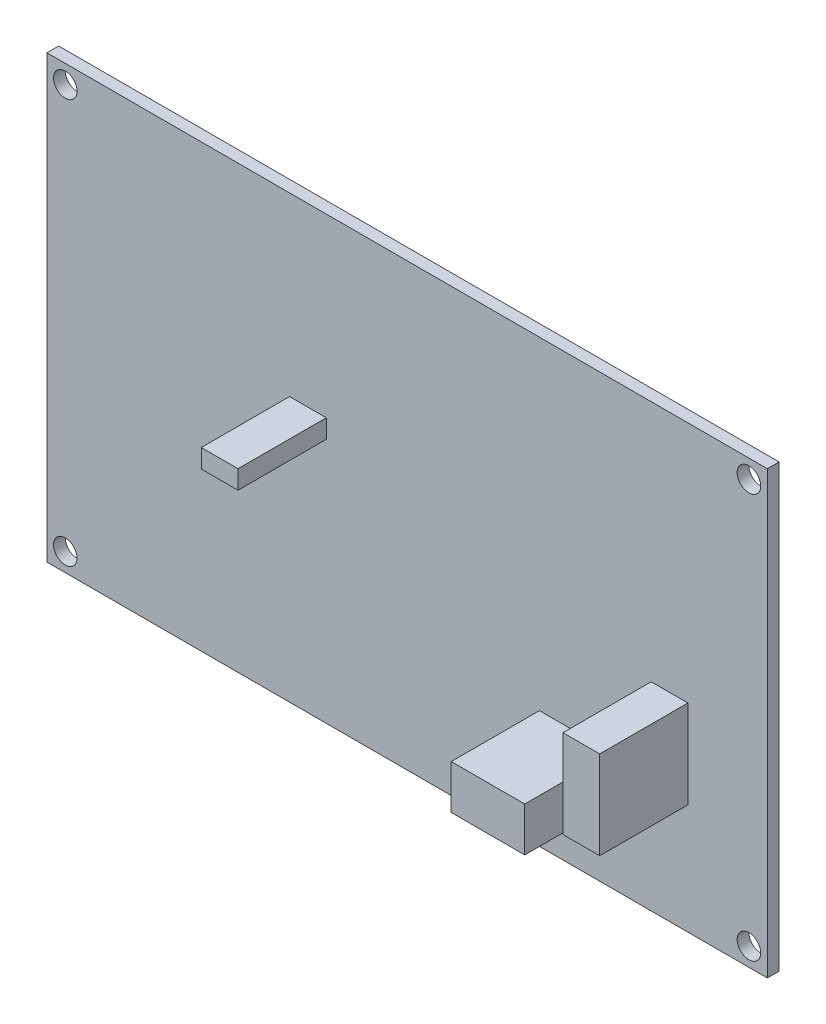
ISO-10303-21;
HEADER;
FILE_DESCRIPTION(('STEP AP214'),'2;1');
FILE_NAME('part.step','',(''),(''),'','','');
FILE_SCHEMA(('AUTOMOTIVE_DESIGN { 1 0 10303 214 1 1 1 1 }'));
ENDSEC;
DATA;
#1=APPLICATION_CONTEXT('core data for automotive mechanical design processes');
#2=APPLICATION_PROTOCOL_DEFINITION('international standard','automotive_design',2000,#1);
#3=PRODUCT_CONTEXT('',#1,'mechanical');
#4=PRODUCT('Part','Part','',(#3));
#5=PRODUCT_RELATED_PRODUCT_CATEGORY('part','',(#4));
#6=PRODUCT_DEFINITION_FORMATION('','',#4);
#7=PRODUCT_DEFINITION_CONTEXT('part definition',#1,'design');
#8=PRODUCT_DEFINITION('design','',#6,#7);
#9=PRODUCT_DEFINITION_SHAPE('','',#8);
#10=(LENGTH_UNIT() NAMED_UNIT(*) SI_UNIT(.MILLI.,.METRE.));
#11=(NAMED_UNIT(*) PLANE_ANGLE_UNIT() SI_UNIT($,.RADIAN.));
#12=(NAMED_UNIT(*) SI_UNIT($,.STERADIAN.) SOLID_ANGLE_UNIT());
#13=UNCERTAINTY_MEASURE_WITH_UNIT(LENGTH_MEASURE(1.E-05),#10,'distance_accuracy_value','');
#14=(GEOMETRIC_REPRESENTATION_CONTEXT(3) GLOBAL_UNCERTAINTY_ASSIGNED_CONTEXT((#13)) GLOBAL_UNIT_ASSIGNED_CONTEXT((#10,
#11,#12)) REPRESENTATION_CONTEXT('',''));
#15=CARTESIAN_POINT('',(0.,0.,0.));
#16=DIRECTION('',(0.,0.,1.));
#17=DIRECTION('',(1.,0.,0.));
#18=AXIS2_PLACEMENT_3D('',#15,#16,#17);
#19=CARTESIAN_POINT('',(0.,0.,1.6));
#20=DIRECTION('',(0.,0.,1.));
#21=DIRECTION('',(1.,0.,0.));
#22=AXIS2_PLACEMENT_3D('',#19,#20,#21);
#23=PLANE('',#22);
#24=CARTESIAN_POINT('',(46.5,27.5,1.6));
#25=DIRECTION('',(0.,0.,-1.));
#26=DIRECTION('',(-1.,0.,0.));
#27=AXIS2_PLACEMENT_3D('',#24,#25,#26);
#28=CIRCLE('',#27,1.6);
#29=CARTESIAN_POINT('',(44.9,27.5,1.6));
#30=VERTEX_POINT('',#29);
#31=EDGE_CURVE('E234',#30,#30,#28,.T.);
#32=ORIENTED_EDGE('',*,*,#31,.T.);
#33=EDGE_LOOP('',(#32));
#34=FACE_BOUND('',#33,.T.);
#35=CARTESIAN_POINT('',(46.5,-27.5,1.6));
#36=DIRECTION('',(0.,0.,1.));
#37=DIRECTION('',(-1.,0.,0.));
#38=AXIS2_PLACEMENT_3D('',#35,#36,#37);
#39=CIRCLE('',#38,1.6);
#40=CARTESIAN_POINT('',(44.9,-27.5,1.6));
#41=VERTEX_POINT('',#40);
#42=EDGE_CURVE('E238',#41,#41,#39,.T.);
#43=ORIENTED_EDGE('',*,*,#42,.F.);
#44=EDGE_LOOP('',(#43));
#45=FACE_BOUND('',#44,.T.);
#46=CARTESIAN_POINT('',(-46.5,-27.5,1.6));
#47=DIRECTION('',(0.,0.,-1.));
#48=DIRECTION('',(1.,0.,0.));
#49=AXIS2_PLACEMENT_3D('',#46,#47,#48);
#50=CIRCLE('',#49,1.6);
#51=CARTESIAN_POINT('',(-44.9,-27.5,1.6));
#52=VERTEX_POINT('',#51);
#53=EDGE_CURVE('E244',#52,#52,#50,.T.);
#54=ORIENTED_EDGE('',*,*,#53,.T.);
#55=EDGE_LOOP('',(#54));
#56=FACE_BOUND('',#55,.T.);
#57=CARTESIAN_POINT('',(-46.5,27.5,1.6));
#58=DIRECTION('',(0.,0.,1.));
#59=DIRECTION('',(1.,0.,0.));
#60=AXIS2_PLACEMENT_3D('',#57,#58,#59);
#61=CIRCLE('',#60,1.6);
#62=CARTESIAN_POINT('',(-44.9,27.5,1.6));
#63=VERTEX_POINT('',#62);
#64=EDGE_CURVE('E250',#63,#63,#61,.T.);
#65=ORIENTED_EDGE('',*,*,#64,.F.);
#66=EDGE_LOOP('',(#65));
#67=FACE_BOUND('',#66,.T.);
#68=DIRECTION('',(0.,1.,0.));
#69=VECTOR('',#68,1.);
#70=CARTESIAN_POINT('',(49.,30.,1.6));
#71=LINE('',#70,#69);
#72=CARTESIAN_POINT('',(49.,-30.,1.6));
#73=VERTEX_POINT('',#72);
#74=CARTESIAN_POINT('',(49.,30.,1.6));
#75=VERTEX_POINT('',#74);
#76=EDGE_CURVE('E259',#73,#75,#71,.T.);
#77=ORIENTED_EDGE('',*,*,#76,.T.);
#78=DIRECTION('',(-1.,0.,0.));
#79=VECTOR('',#78,1.);
#80=CARTESIAN_POINT('',(-49.,30.,1.6));
#81=LINE('',#80,#79);
#82=CARTESIAN_POINT('',(-49.,30.,1.6));
#83=VERTEX_POINT('',#82);
#84=EDGE_CURVE('E262',#75,#83,#81,.T.);
#85=ORIENTED_EDGE('',*,*,#84,.T.);
#86=DIRECTION('',(0.,-1.,0.));
#87=VECTOR('',#86,1.);
#88=CARTESIAN_POINT('',(-49.,30.,1.6));
#89=LINE('',#88,#87);
#90=CARTESIAN_POINT('',(-49.,-30.,1.6));
#91=VERTEX_POINT('',#90);
#92=EDGE_CURVE('E265',#83,#91,#89,.T.);
#93=ORIENTED_EDGE('',*,*,#92,.T.);
#94=DIRECTION('',(1.,0.,0.));
#95=VECTOR('',#94,1.);
#96=CARTESIAN_POINT('',(-49.,-30.,1.6));
#97=LINE('',#96,#95);
#98=EDGE_CURVE('E267',#91,#73,#97,.T.);
#99=ORIENTED_EDGE('',*,*,#98,.T.);
#100=EDGE_LOOP('',(#77,#85,#93,#99));
#101=FACE_BOUND('',#100,.T.);
#102=DIRECTION('',(1.,0.,0.));
#103=VECTOR('',#102,1.);
#104=CARTESIAN_POINT('',(33.2,-15.,1.6));
#105=LINE('',#104,#103);
#106=CARTESIAN_POINT('',(33.2,-15.,1.6));
#107=VERTEX_POINT('',#106);
#108=CARTESIAN_POINT('',(38.2,-15.,1.6));
#109=VERTEX_POINT('',#108);
#110=EDGE_CURVE('E219',#107,#109,#105,.T.);
#111=ORIENTED_EDGE('',*,*,#110,.F.);
#112=DIRECTION('',(0.,-1.,0.));
#113=VECTOR('',#112,1.);
#114=CARTESIAN_POINT('',(33.2,-3.,1.6));
#115=LINE('',#114,#113);
#116=CARTESIAN_POINT('',(33.2,-3.,1.6));
#117=VERTEX_POINT('',#116);
#118=EDGE_CURVE('E205',#117,#107,#115,.T.);
#119=ORIENTED_EDGE('',*,*,#118,.F.);
#120=DIRECTION('',(-1.,0.,0.));
#121=VECTOR('',#120,1.);
#122=CARTESIAN_POINT('',(33.2,-3.,1.6));
#123=LINE('',#122,#121);
#124=CARTESIAN_POINT('',(38.2,-3.,1.6));
#125=VERTEX_POINT('',#124);
#126=EDGE_CURVE('E210',#125,#117,#123,.T.);
#127=ORIENTED_EDGE('',*,*,#126,.F.);
#128=DIRECTION('',(0.,1.,0.));
#129=VECTOR('',#128,1.);
#130=CARTESIAN_POINT('',(38.2,-3.,1.6));
#131=LINE('',#130,#129);
#132=EDGE_CURVE('E221',#109,#125,#131,.T.);
#133=ORIENTED_EDGE('',*,*,#132,.F.);
#134=EDGE_LOOP('',(#111,#119,#127,#133));
#135=FACE_BOUND('',#134,.T.);
#136=DIRECTION('',(1.,0.,0.));
#137=VECTOR('',#136,1.);
#138=CARTESIAN_POINT('',(18.,-20.,1.6));
#139=LINE('',#138,#137);
#140=CARTESIAN_POINT('',(18.,-20.,1.6));
#141=VERTEX_POINT('',#140);
#142=CARTESIAN_POINT('',(28.,-20.,1.6));
#143=VERTEX_POINT('',#142);
#144=EDGE_CURVE('E177',#141,#143,#139,.T.);
#145=ORIENTED_EDGE('',*,*,#144,.F.);
#146=DIRECTION('',(0.,-1.,0.));
#147=VECTOR('',#146,1.);
#148=CARTESIAN_POINT('',(18.,-14.,1.6));
#149=LINE('',#148,#147);
#150=CARTESIAN_POINT('',(18.,-14.,1.6));
#151=VERTEX_POINT('',#150);
#152=EDGE_CURVE('E174',#151,#141,#149,.T.);
#153=ORIENTED_EDGE('',*,*,#152,.F.);
#154=DIRECTION('',(-1.,0.,0.));
#155=VECTOR('',#154,1.);
#156=CARTESIAN_POINT('',(18.,-14.,1.6));
#157=LINE('',#156,#155);
#158=CARTESIAN_POINT('',(28.,-14.,1.6));
#159=VERTEX_POINT('',#158);
#160=EDGE_CURVE('E186',#159,#151,#157,.T.);
#161=ORIENTED_EDGE('',*,*,#160,.F.);
#162=DIRECTION('',(0.,1.,0.));
#163=VECTOR('',#162,1.);
#164=CARTESIAN_POINT('',(28.,-14.,1.6));
#165=LINE('',#164,#163);
#166=EDGE_CURVE('E194',#143,#159,#165,.T.);
#167=ORIENTED_EDGE('',*,*,#166,.F.);
#168=EDGE_LOOP('',(#145,#153,#161,#167));
#169=FACE_BOUND('',#168,.T.);
#170=DIRECTION('',(1.,0.,0.));
#171=VECTOR('',#170,1.);
#172=CARTESIAN_POINT('',(-16.,3.46,1.6));
#173=LINE('',#172,#171);
#174=CARTESIAN_POINT('',(-16.,3.46,1.6));
#175=VERTEX_POINT('',#174);
#176=CARTESIAN_POINT('',(-11.,3.46,1.6));
#177=VERTEX_POINT('',#176);
#178=EDGE_CURVE('E541',#175,#177,#173,.T.);
#179=ORIENTED_EDGE('',*,*,#178,.F.);
#180=DIRECTION('',(0.,-1.,0.));
#181=VECTOR('',#180,1.);
#182=CARTESIAN_POINT('',(-16.,6.,1.6));
#183=LINE('',#182,#181);
#184=CARTESIAN_POINT('',(-16.,6.,1.6));
#185=VERTEX_POINT('',#184);
#186=EDGE_CURVE('E172',#185,#175,#183,.T.);
#187=ORIENTED_EDGE('',*,*,#186,.F.);
#188=DIRECTION('',(-1.,0.,0.));
#189=VECTOR('',#188,1.);
#190=CARTESIAN_POINT('',(-16.,6.,1.6));
#191=LINE('',#190,#189);
#192=CARTESIAN_POINT('',(-11.,6.,1.6));
#193=VERTEX_POINT('',#192);
#194=EDGE_CURVE('E168',#193,#185,#191,.T.);
#195=ORIENTED_EDGE('',*,*,#194,.F.);
#196=DIRECTION('',(0.,1.,0.));
#197=VECTOR('',#196,1.);
#198=CARTESIAN_POINT('',(-11.,6.,1.6));
#199=LINE('',#198,#197);
#200=EDGE_CURVE('E538',#177,#193,#199,.T.);
#201=ORIENTED_EDGE('',*,*,#200,.F.);
#202=EDGE_LOOP('',(#179,#187,#195,#201));
#203=FACE_BOUND('',#202,.T.);
#204=ADVANCED_FACE('F35',(#34,#45,#56,#67,#101,#135,#169,#203),#23,.T.);
#205=CARTESIAN_POINT('',(49.,30.,1.6));
#206=DIRECTION('',(-1.,0.,0.));
#207=DIRECTION('',(0.,0.,1.));
#208=AXIS2_PLACEMENT_3D('',#205,#206,#207);
#209=PLANE('',#208);
#210=DIRECTION('',(0.,1.,0.));
#211=VECTOR('',#210,1.);
#212=CARTESIAN_POINT('',(49.,30.,0.));
#213=LINE('',#212,#211);
#214=CARTESIAN_POINT('',(49.,-30.,0.));
#215=VERTEX_POINT('',#214);
#216=CARTESIAN_POINT('',(49.,30.,0.));
#217=VERTEX_POINT('',#216);
#218=EDGE_CURVE('E256',#215,#217,#213,.T.);
#219=ORIENTED_EDGE('',*,*,#218,.T.);
#220=DIRECTION('',(0.,0.,-1.));
#221=VECTOR('',#220,1.);
#222=CARTESIAN_POINT('',(49.,30.,1.6));
#223=LINE('',#222,#221);
#224=EDGE_CURVE('E11',#75,#217,#223,.T.);
#225=ORIENTED_EDGE('',*,*,#224,.F.);
#226=ORIENTED_EDGE('',*,*,#76,.F.);
#227=DIRECTION('',(0.,0.,-1.));
#228=VECTOR('',#227,1.);
#229=CARTESIAN_POINT('',(49.,-30.,1.6));
#230=LINE('',#229,#228);
#231=EDGE_CURVE('E269',#73,#215,#230,.T.);
#232=ORIENTED_EDGE('',*,*,#231,.T.);
#233=EDGE_LOOP('',(#219,#225,#226,#232));
#234=FACE_BOUND('',#233,.T.);
#235=ADVANCED_FACE('F37',(#234),#209,.F.);
#236=CARTESIAN_POINT('',(-49.,30.,1.6));
#237=DIRECTION('',(0.,-1.,0.));
#238=DIRECTION('',(0.,0.,-1.));
#239=AXIS2_PLACEMENT_3D('',#236,#237,#238);
#240=PLANE('',#239);
#241=DIRECTION('',(-1.,0.,0.));
#242=VECTOR('',#241,1.);
#243=CARTESIAN_POINT('',(-49.,30.,0.));
#244=LINE('',#243,#242);
#245=CARTESIAN_POINT('',(-49.,30.,0.));
#246=VERTEX_POINT('',#245);
#247=EDGE_CURVE('E272',#217,#246,#244,.T.);
#248=ORIENTED_EDGE('',*,*,#247,.T.);
#249=DIRECTION('',(0.,0.,-1.));
#250=VECTOR('',#249,1.);
#251=CARTESIAN_POINT('',(-49.,30.,1.6));
#252=LINE('',#251,#250);
#253=EDGE_CURVE('E43',#83,#246,#252,.T.);
#254=ORIENTED_EDGE('',*,*,#253,.F.);
#255=ORIENTED_EDGE('',*,*,#84,.F.);
#256=ORIENTED_EDGE('',*,*,#224,.T.);
#257=EDGE_LOOP('',(#248,#254,#255,#256));
#258=FACE_BOUND('',#257,.T.);
#259=ADVANCED_FACE('F302',(#258),#240,.F.);
#260=CARTESIAN_POINT('',(-49.,30.,1.6));
#261=DIRECTION('',(1.,0.,0.));
#262=DIRECTION('',(0.,0.,-1.));
#263=AXIS2_PLACEMENT_3D('',#260,#261,#262);
#264=PLANE('',#263);
#265=DIRECTION('',(0.,-1.,0.));
#266=VECTOR('',#265,1.);
#267=CARTESIAN_POINT('',(-49.,30.,0.));
#268=LINE('',#267,#266);
#269=CARTESIAN_POINT('',(-49.,-30.,0.));
#270=VERTEX_POINT('',#269);
#271=EDGE_CURVE('E274',#246,#270,#268,.T.);
#272=ORIENTED_EDGE('',*,*,#271,.T.);
#273=DIRECTION('',(0.,0.,-1.));
#274=VECTOR('',#273,1.);
#275=CARTESIAN_POINT('',(-49.,-30.,1.6));
#276=LINE('',#275,#274);
#277=EDGE_CURVE('E279',#91,#270,#276,.T.);
#278=ORIENTED_EDGE('',*,*,#277,.F.);
#279=ORIENTED_EDGE('',*,*,#92,.F.);
#280=ORIENTED_EDGE('',*,*,#253,.T.);
#281=EDGE_LOOP('',(#272,#278,#279,#280));
#282=FACE_BOUND('',#281,.T.);
#283=ADVANCED_FACE('F286',(#282),#264,.F.);
#284=CARTESIAN_POINT('',(-49.,-30.,1.6));
#285=DIRECTION('',(0.,1.,0.));
#286=DIRECTION('',(-1.,0.,0.));
#287=AXIS2_PLACEMENT_3D('',#284,#285,#286);
#288=PLANE('',#287);
#289=DIRECTION('',(1.,0.,0.));
#290=VECTOR('',#289,1.);
#291=CARTESIAN_POINT('',(-49.,-30.,0.));
#292=LINE('',#291,#290);
#293=EDGE_CURVE('E263',#270,#215,#292,.T.);
#294=ORIENTED_EDGE('',*,*,#293,.T.);
#295=ORIENTED_EDGE('',*,*,#231,.F.);
#296=ORIENTED_EDGE('',*,*,#98,.F.);
#297=ORIENTED_EDGE('',*,*,#277,.T.);
#298=EDGE_LOOP('',(#294,#295,#296,#297));
#299=FACE_BOUND('',#298,.T.);
#300=ADVANCED_FACE('F295',(#299),#288,.F.);
#301=CARTESIAN_POINT('',(0.,0.,0.));
#302=DIRECTION('',(0.,0.,1.));
#303=DIRECTION('',(1.,0.,0.));
#304=AXIS2_PLACEMENT_3D('',#301,#302,#303);
#305=PLANE('',#304);
#306=CARTESIAN_POINT('',(46.5,27.5,0.));
#307=DIRECTION('',(0.,0.,-1.));
#308=DIRECTION('',(-1.,0.,0.));
#309=AXIS2_PLACEMENT_3D('',#306,#307,#308);
#310=CIRCLE('',#309,1.6);
#311=CARTESIAN_POINT('',(44.9,27.5,0.));
#312=VERTEX_POINT('',#311);
#313=EDGE_CURVE('E235',#312,#312,#310,.T.);
#314=ORIENTED_EDGE('',*,*,#313,.F.);
#315=EDGE_LOOP('',(#314));
#316=FACE_BOUND('',#315,.T.);
#317=CARTESIAN_POINT('',(46.5,-27.5,0.));
#318=DIRECTION('',(0.,0.,1.));
#319=DIRECTION('',(-1.,0.,0.));
#320=AXIS2_PLACEMENT_3D('',#317,#318,#319);
#321=CIRCLE('',#320,1.6);
#322=CARTESIAN_POINT('',(44.9,-27.5,0.));
#323=VERTEX_POINT('',#322);
#324=EDGE_CURVE('E241',#323,#323,#321,.T.);
#325=ORIENTED_EDGE('',*,*,#324,.T.);
#326=EDGE_LOOP('',(#325));
#327=FACE_BOUND('',#326,.T.);
#328=CARTESIAN_POINT('',(-46.5,-27.5,0.));
#329=DIRECTION('',(0.,0.,-1.));
#330=DIRECTION('',(1.,0.,0.));
#331=AXIS2_PLACEMENT_3D('',#328,#329,#330);
#332=CIRCLE('',#331,1.6);
#333=CARTESIAN_POINT('',(-44.9,-27.5,0.));
#334=VERTEX_POINT('',#333);
#335=EDGE_CURVE('E247',#334,#334,#332,.T.);
#336=ORIENTED_EDGE('',*,*,#335,.F.);
#337=EDGE_LOOP('',(#336));
#338=FACE_BOUND('',#337,.T.);
#339=CARTESIAN_POINT('',(-46.5,27.5,0.));
#340=DIRECTION('',(0.,0.,1.));
#341=DIRECTION('',(1.,0.,0.));
#342=AXIS2_PLACEMENT_3D('',#339,#340,#341);
#343=CIRCLE('',#342,1.6);
#344=CARTESIAN_POINT('',(-44.9,27.5,0.));
#345=VERTEX_POINT('',#344);
#346=EDGE_CURVE('E253',#345,#345,#343,.T.);
#347=ORIENTED_EDGE('',*,*,#346,.T.);
#348=EDGE_LOOP('',(#347));
#349=FACE_BOUND('',#348,.T.);
#350=ORIENTED_EDGE('',*,*,#218,.F.);
#351=ORIENTED_EDGE('',*,*,#293,.F.);
#352=ORIENTED_EDGE('',*,*,#271,.F.);
#353=ORIENTED_EDGE('',*,*,#247,.F.);
#354=EDGE_LOOP('',(#350,#351,#352,#353));
#355=FACE_BOUND('',#354,.T.);
#356=ADVANCED_FACE('F292',(#316,#327,#338,#349,#355),#305,.F.);
#357=CARTESIAN_POINT('',(-46.5,27.5,0.));
#358=DIRECTION('',(0.,0.,1.));
#359=DIRECTION('',(1.,0.,0.));
#360=AXIS2_PLACEMENT_3D('',#357,#358,#359);
#361=CYLINDRICAL_SURFACE('',#360,1.6);
#362=ORIENTED_EDGE('',*,*,#346,.F.);
#363=EDGE_LOOP('',(#362));
#364=FACE_BOUND('',#363,.T.);
#365=ORIENTED_EDGE('',*,*,#64,.T.);
#366=EDGE_LOOP('',(#365));
#367=FACE_BOUND('',#366,.T.);
#368=ADVANCED_FACE('F317',(#364,#367),#361,.F.);
#369=CARTESIAN_POINT('',(-46.5,-27.5,0.));
#370=DIRECTION('',(0.,0.,1.));
#371=DIRECTION('',(1.,0.,0.));
#372=AXIS2_PLACEMENT_3D('',#369,#370,#371);
#373=CYLINDRICAL_SURFACE('',#372,1.6);
#374=ORIENTED_EDGE('',*,*,#335,.T.);
#375=EDGE_LOOP('',(#374));
#376=FACE_BOUND('',#375,.T.);
#377=ORIENTED_EDGE('',*,*,#53,.F.);
#378=EDGE_LOOP('',(#377));
#379=FACE_BOUND('',#378,.T.);
#380=ADVANCED_FACE('F339',(#376,#379),#373,.F.);
#381=CARTESIAN_POINT('',(46.5,-27.5,0.));
#382=DIRECTION('',(0.,0.,1.));
#383=DIRECTION('',(1.,0.,0.));
#384=AXIS2_PLACEMENT_3D('',#381,#382,#383);
#385=CYLINDRICAL_SURFACE('',#384,1.6);
#386=ORIENTED_EDGE('',*,*,#324,.F.);
#387=EDGE_LOOP('',(#386));
#388=FACE_BOUND('',#387,.T.);
#389=ORIENTED_EDGE('',*,*,#42,.T.);
#390=EDGE_LOOP('',(#389));
#391=FACE_BOUND('',#390,.T.);
#392=ADVANCED_FACE('F345',(#388,#391),#385,.F.);
#393=CARTESIAN_POINT('',(46.5,27.5,0.));
#394=DIRECTION('',(0.,0.,1.));
#395=DIRECTION('',(1.,0.,0.));
#396=AXIS2_PLACEMENT_3D('',#393,#394,#395);
#397=CYLINDRICAL_SURFACE('',#396,1.6);
#398=ORIENTED_EDGE('',*,*,#313,.T.);
#399=EDGE_LOOP('',(#398));
#400=FACE_BOUND('',#399,.T.);
#401=ORIENTED_EDGE('',*,*,#31,.F.);
#402=EDGE_LOOP('',(#401));
#403=FACE_BOUND('',#402,.T.);
#404=ADVANCED_FACE('F351',(#400,#403),#397,.F.);
#405=CARTESIAN_POINT('',(33.2,-3.,13.6));
#406=DIRECTION('',(1.,0.,0.));
#407=DIRECTION('',(0.,1.,0.));
#408=AXIS2_PLACEMENT_3D('',#405,#406,#407);
#409=PLANE('',#408);
#410=ORIENTED_EDGE('',*,*,#118,.T.);
#411=DIRECTION('',(0.,0.,-1.));
#412=VECTOR('',#411,1.);
#413=CARTESIAN_POINT('',(33.2,-15.,13.6));
#414=LINE('',#413,#412);
#415=CARTESIAN_POINT('',(33.2,-15.,13.6));
#416=VERTEX_POINT('',#415);
#417=EDGE_CURVE('E232',#416,#107,#414,.T.);
#418=ORIENTED_EDGE('',*,*,#417,.F.);
#419=DIRECTION('',(0.,-1.,0.));
#420=VECTOR('',#419,1.);
#421=CARTESIAN_POINT('',(33.2,-3.,13.6));
#422=LINE('',#421,#420);
#423=CARTESIAN_POINT('',(33.2,-3.,13.6));
#424=VERTEX_POINT('',#423);
#425=EDGE_CURVE('E206',#424,#416,#422,.T.);
#426=ORIENTED_EDGE('',*,*,#425,.F.);
#427=DIRECTION('',(0.,0.,-1.));
#428=VECTOR('',#427,1.);
#429=CARTESIAN_POINT('',(33.2,-3.,13.6));
#430=LINE('',#429,#428);
#431=EDGE_CURVE('E216',#424,#117,#430,.T.);
#432=ORIENTED_EDGE('',*,*,#431,.T.);
#433=EDGE_LOOP('',(#410,#418,#426,#432));
#434=FACE_BOUND('',#433,.T.);
#435=ADVANCED_FACE('F359',(#434),#409,.F.);
#436=CARTESIAN_POINT('',(33.2,-15.,13.6));
#437=DIRECTION('',(0.,1.,0.));
#438=DIRECTION('',(0.,0.,1.));
#439=AXIS2_PLACEMENT_3D('',#436,#437,#438);
#440=PLANE('',#439);
#441=ORIENTED_EDGE('',*,*,#110,.T.);
#442=DIRECTION('',(0.,0.,-1.));
#443=VECTOR('',#442,1.);
#444=CARTESIAN_POINT('',(38.2,-15.,13.6));
#445=LINE('',#444,#443);
#446=CARTESIAN_POINT('',(38.2,-15.,13.6));
#447=VERTEX_POINT('',#446);
#448=EDGE_CURVE('E229',#447,#109,#445,.T.);
#449=ORIENTED_EDGE('',*,*,#448,.F.);
#450=DIRECTION('',(1.,0.,0.));
#451=VECTOR('',#450,1.);
#452=CARTESIAN_POINT('',(33.2,-15.,13.6));
#453=LINE('',#452,#451);
#454=EDGE_CURVE('E209',#416,#447,#453,.T.);
#455=ORIENTED_EDGE('',*,*,#454,.F.);
#456=ORIENTED_EDGE('',*,*,#417,.T.);
#457=EDGE_LOOP('',(#441,#449,#455,#456));
#458=FACE_BOUND('',#457,.T.);
#459=ADVANCED_FACE('F367',(#458),#440,.F.);
#460=CARTESIAN_POINT('',(38.2,-3.,13.6));
#461=DIRECTION('',(-1.,0.,0.));
#462=DIRECTION('',(0.,0.,1.));
#463=AXIS2_PLACEMENT_3D('',#460,#461,#462);
#464=PLANE('',#463);
#465=ORIENTED_EDGE('',*,*,#132,.T.);
#466=DIRECTION('',(0.,0.,-1.));
#467=VECTOR('',#466,1.);
#468=CARTESIAN_POINT('',(38.2,-3.,13.6));
#469=LINE('',#468,#467);
#470=CARTESIAN_POINT('',(38.2,-3.,13.6));
#471=VERTEX_POINT('',#470);
#472=EDGE_CURVE('E227',#471,#125,#469,.T.);
#473=ORIENTED_EDGE('',*,*,#472,.F.);
#474=DIRECTION('',(0.,1.,0.));
#475=VECTOR('',#474,1.);
#476=CARTESIAN_POINT('',(38.2,-3.,13.6));
#477=LINE('',#476,#475);
#478=EDGE_CURVE('E212',#447,#471,#477,.T.);
#479=ORIENTED_EDGE('',*,*,#478,.F.);
#480=ORIENTED_EDGE('',*,*,#448,.T.);
#481=EDGE_LOOP('',(#465,#473,#479,#480));
#482=FACE_BOUND('',#481,.T.);
#483=ADVANCED_FACE('F375',(#482),#464,.F.);
#484=CARTESIAN_POINT('',(33.2,-3.,13.6));
#485=DIRECTION('',(0.,-1.,0.));
#486=DIRECTION('',(1.,0.,0.));
#487=AXIS2_PLACEMENT_3D('',#484,#485,#486);
#488=PLANE('',#487);
#489=ORIENTED_EDGE('',*,*,#126,.T.);
#490=ORIENTED_EDGE('',*,*,#431,.F.);
#491=DIRECTION('',(-1.,0.,0.));
#492=VECTOR('',#491,1.);
#493=CARTESIAN_POINT('',(33.2,-3.,13.6));
#494=LINE('',#493,#492);
#495=EDGE_CURVE('E214',#471,#424,#494,.T.);
#496=ORIENTED_EDGE('',*,*,#495,.F.);
#497=ORIENTED_EDGE('',*,*,#472,.T.);
#498=EDGE_LOOP('',(#489,#490,#496,#497));
#499=FACE_BOUND('',#498,.T.);
#500=ADVANCED_FACE('F383',(#499),#488,.F.);
#501=CARTESIAN_POINT('',(0.,0.,13.6));
#502=DIRECTION('',(0.,0.,1.));
#503=DIRECTION('',(1.,0.,0.));
#504=AXIS2_PLACEMENT_3D('',#501,#502,#503);
#505=PLANE('',#504);
#506=ORIENTED_EDGE('',*,*,#425,.T.);
#507=ORIENTED_EDGE('',*,*,#454,.T.);
#508=ORIENTED_EDGE('',*,*,#478,.T.);
#509=ORIENTED_EDGE('',*,*,#495,.T.);
#510=EDGE_LOOP('',(#506,#507,#508,#509));
#511=FACE_BOUND('',#510,.T.);
#512=ADVANCED_FACE('F391',(#511),#505,.T.);
#513=CARTESIAN_POINT('',(18.,-14.,13.6));
#514=DIRECTION('',(1.,0.,0.));
#515=DIRECTION('',(0.,0.,-1.));
#516=AXIS2_PLACEMENT_3D('',#513,#514,#515);
#517=PLANE('',#516);
#518=ORIENTED_EDGE('',*,*,#152,.T.);
#519=DIRECTION('',(0.,0.,-1.));
#520=VECTOR('',#519,1.);
#521=CARTESIAN_POINT('',(18.,-20.,13.6));
#522=LINE('',#521,#520);
#523=CARTESIAN_POINT('',(18.,-20.,13.6));
#524=VERTEX_POINT('',#523);
#525=EDGE_CURVE('E203',#524,#141,#522,.T.);
#526=ORIENTED_EDGE('',*,*,#525,.F.);
#527=DIRECTION('',(0.,-1.,0.));
#528=VECTOR('',#527,1.);
#529=CARTESIAN_POINT('',(18.,-14.,13.6));
#530=LINE('',#529,#528);
#531=CARTESIAN_POINT('',(18.,-14.,13.6));
#532=VERTEX_POINT('',#531);
#533=EDGE_CURVE('E182',#532,#524,#530,.T.);
#534=ORIENTED_EDGE('',*,*,#533,.F.);
#535=DIRECTION('',(0.,0.,-1.));
#536=VECTOR('',#535,1.);
#537=CARTESIAN_POINT('',(18.,-14.,13.6));
#538=LINE('',#537,#536);
#539=EDGE_CURVE('E191',#532,#151,#538,.T.);
#540=ORIENTED_EDGE('',*,*,#539,.T.);
#541=EDGE_LOOP('',(#518,#526,#534,#540));
#542=FACE_BOUND('',#541,.T.);
#543=ADVANCED_FACE('F399',(#542),#517,.F.);
#544=CARTESIAN_POINT('',(18.,-20.,13.6));
#545=DIRECTION('',(0.,1.,0.));
#546=DIRECTION('',(0.,0.,1.));
#547=AXIS2_PLACEMENT_3D('',#544,#545,#546);
#548=PLANE('',#547);
#549=ORIENTED_EDGE('',*,*,#144,.T.);
#550=DIRECTION('',(0.,0.,-1.));
#551=VECTOR('',#550,1.);
#552=CARTESIAN_POINT('',(28.,-20.,13.6));
#553=LINE('',#552,#551);
#554=CARTESIAN_POINT('',(28.,-20.,13.6));
#555=VERTEX_POINT('',#554);
#556=EDGE_CURVE('E200',#555,#143,#553,.T.);
#557=ORIENTED_EDGE('',*,*,#556,.F.);
#558=DIRECTION('',(1.,0.,0.));
#559=VECTOR('',#558,1.);
#560=CARTESIAN_POINT('',(18.,-20.,13.6));
#561=LINE('',#560,#559);
#562=EDGE_CURVE('E185',#524,#555,#561,.T.);
#563=ORIENTED_EDGE('',*,*,#562,.F.);
#564=ORIENTED_EDGE('',*,*,#525,.T.);
#565=EDGE_LOOP('',(#549,#557,#563,#564));
#566=FACE_BOUND('',#565,.T.);
#567=ADVANCED_FACE('F407',(#566),#548,.F.);
#568=CARTESIAN_POINT('',(28.,-14.,13.6));
#569=DIRECTION('',(-1.,0.,0.));
#570=DIRECTION('',(0.,0.,1.));
#571=AXIS2_PLACEMENT_3D('',#568,#569,#570);
#572=PLANE('',#571);
#573=ORIENTED_EDGE('',*,*,#166,.T.);
#574=DIRECTION('',(0.,0.,-1.));
#575=VECTOR('',#574,1.);
#576=CARTESIAN_POINT('',(28.,-14.,13.6));
#577=LINE('',#576,#575);
#578=CARTESIAN_POINT('',(28.,-14.,13.6));
#579=VERTEX_POINT('',#578);
#580=EDGE_CURVE('E58',#579,#159,#577,.T.);
#581=ORIENTED_EDGE('',*,*,#580,.F.);
#582=DIRECTION('',(0.,1.,0.));
#583=VECTOR('',#582,1.);
#584=CARTESIAN_POINT('',(28.,-14.,13.6));
#585=LINE('',#584,#583);
#586=EDGE_CURVE('E188',#555,#579,#585,.T.);
#587=ORIENTED_EDGE('',*,*,#586,.F.);
#588=ORIENTED_EDGE('',*,*,#556,.T.);
#589=EDGE_LOOP('',(#573,#581,#587,#588));
#590=FACE_BOUND('',#589,.T.);
#591=ADVANCED_FACE('F415',(#590),#572,.F.);
#592=CARTESIAN_POINT('',(18.,-14.,13.6));
#593=DIRECTION('',(0.,-1.,0.));
#594=DIRECTION('',(0.,0.,-1.));
#595=AXIS2_PLACEMENT_3D('',#592,#593,#594);
#596=PLANE('',#595);
#597=ORIENTED_EDGE('',*,*,#160,.T.);
#598=ORIENTED_EDGE('',*,*,#539,.F.);
#599=DIRECTION('',(-1.,0.,0.));
#600=VECTOR('',#599,1.);
#601=CARTESIAN_POINT('',(18.,-14.,13.6));
#602=LINE('',#601,#600);
#603=EDGE_CURVE('E190',#579,#532,#602,.T.);
#604=ORIENTED_EDGE('',*,*,#603,.F.);
#605=ORIENTED_EDGE('',*,*,#580,.T.);
#606=EDGE_LOOP('',(#597,#598,#604,#605));
#607=FACE_BOUND('',#606,.T.);
#608=ADVANCED_FACE('F423',(#607),#596,.F.);
#609=CARTESIAN_POINT('',(0.,0.,13.6));
#610=DIRECTION('',(0.,0.,1.));
#611=DIRECTION('',(1.,0.,0.));
#612=AXIS2_PLACEMENT_3D('',#609,#610,#611);
#613=PLANE('',#612);
#614=ORIENTED_EDGE('',*,*,#533,.T.);
#615=ORIENTED_EDGE('',*,*,#562,.T.);
#616=ORIENTED_EDGE('',*,*,#586,.T.);
#617=ORIENTED_EDGE('',*,*,#603,.T.);
#618=EDGE_LOOP('',(#614,#615,#616,#617));
#619=FACE_BOUND('',#618,.T.);
#620=ADVANCED_FACE('F431',(#619),#613,.T.);
#621=CARTESIAN_POINT('',(-16.,6.,13.6));
#622=DIRECTION('',(1.,0.,0.));
#623=DIRECTION('',(0.,0.,-1.));
#624=AXIS2_PLACEMENT_3D('',#621,#622,#623);
#625=PLANE('',#624);
#626=ORIENTED_EDGE('',*,*,#186,.T.);
#627=DIRECTION('',(0.,0.,-1.));
#628=VECTOR('',#627,1.);
#629=CARTESIAN_POINT('',(-16.,3.46,13.6));
#630=LINE('',#629,#628);
#631=CARTESIAN_POINT('',(-16.,3.46,13.6));
#632=VERTEX_POINT('',#631);
#633=EDGE_CURVE('E153',#632,#175,#630,.T.);
#634=ORIENTED_EDGE('',*,*,#633,.F.);
#635=DIRECTION('',(0.,-1.,0.));
#636=VECTOR('',#635,1.);
#637=CARTESIAN_POINT('',(-16.,6.,13.6));
#638=LINE('',#637,#636);
#639=CARTESIAN_POINT('',(-16.,6.,13.6));
#640=VERTEX_POINT('',#639);
#641=EDGE_CURVE('E160',#640,#632,#638,.T.);
#642=ORIENTED_EDGE('',*,*,#641,.F.);
#643=DIRECTION('',(0.,0.,-1.));
#644=VECTOR('',#643,1.);
#645=CARTESIAN_POINT('',(-16.,6.,13.6));
#646=LINE('',#645,#644);
#647=EDGE_CURVE('E535',#640,#185,#646,.T.);
#648=ORIENTED_EDGE('',*,*,#647,.T.);
#649=EDGE_LOOP('',(#626,#634,#642,#648));
#650=FACE_BOUND('',#649,.T.);
#651=ADVANCED_FACE('F170',(#650),#625,.F.);
#652=CARTESIAN_POINT('',(-16.,3.46,13.6));
#653=DIRECTION('',(0.,1.,0.));
#654=DIRECTION('',(0.,0.,1.));
#655=AXIS2_PLACEMENT_3D('',#652,#653,#654);
#656=PLANE('',#655);
#657=ORIENTED_EDGE('',*,*,#178,.T.);
#658=DIRECTION('',(0.,0.,-1.));
#659=VECTOR('',#658,1.);
#660=CARTESIAN_POINT('',(-11.,3.46,13.6));
#661=LINE('',#660,#659);
#662=CARTESIAN_POINT('',(-11.,3.46,13.6));
#663=VERTEX_POINT('',#662);
#664=EDGE_CURVE('E156',#663,#177,#661,.T.);
#665=ORIENTED_EDGE('',*,*,#664,.F.);
#666=DIRECTION('',(1.,0.,0.));
#667=VECTOR('',#666,1.);
#668=CARTESIAN_POINT('',(-16.,3.46,13.6));
#669=LINE('',#668,#667);
#670=EDGE_CURVE('E149',#632,#663,#669,.T.);
#671=ORIENTED_EDGE('',*,*,#670,.F.);
#672=ORIENTED_EDGE('',*,*,#633,.T.);
#673=EDGE_LOOP('',(#657,#665,#671,#672));
#674=FACE_BOUND('',#673,.T.);
#675=ADVANCED_FACE('F151',(#674),#656,.F.);
#676=CARTESIAN_POINT('',(-11.,6.,13.6));
#677=DIRECTION('',(-1.,0.,0.));
#678=DIRECTION('',(0.,0.,1.));
#679=AXIS2_PLACEMENT_3D('',#676,#677,#678);
#680=PLANE('',#679);
#681=ORIENTED_EDGE('',*,*,#200,.T.);
#682=DIRECTION('',(0.,0.,-1.));
#683=VECTOR('',#682,1.);
#684=CARTESIAN_POINT('',(-11.,6.,13.6));
#685=LINE('',#684,#683);
#686=CARTESIAN_POINT('',(-11.,6.,13.6));
#687=VERTEX_POINT('',#686);
#688=EDGE_CURVE('E50',#687,#193,#685,.T.);
#689=ORIENTED_EDGE('',*,*,#688,.F.);
#690=DIRECTION('',(0.,1.,0.));
#691=VECTOR('',#690,1.);
#692=CARTESIAN_POINT('',(-11.,6.,13.6));
#693=LINE('',#692,#691);
#694=EDGE_CURVE('E159',#663,#687,#693,.T.);
#695=ORIENTED_EDGE('',*,*,#694,.F.);
#696=ORIENTED_EDGE('',*,*,#664,.T.);
#697=EDGE_LOOP('',(#681,#689,#695,#696));
#698=FACE_BOUND('',#697,.T.);
#699=ADVANCED_FACE('F451',(#698),#680,.F.);
#700=CARTESIAN_POINT('',(-16.,6.,13.6));
#701=DIRECTION('',(0.,-1.,0.));
#702=DIRECTION('',(0.,0.,-1.));
#703=AXIS2_PLACEMENT_3D('',#700,#701,#702);
#704=PLANE('',#703);
#705=ORIENTED_EDGE('',*,*,#194,.T.);
#706=ORIENTED_EDGE('',*,*,#647,.F.);
#707=DIRECTION('',(-1.,0.,0.));
#708=VECTOR('',#707,1.);
#709=CARTESIAN_POINT('',(-16.,6.,13.6));
#710=LINE('',#709,#708);
#711=EDGE_CURVE('E164',#687,#640,#710,.T.);
#712=ORIENTED_EDGE('',*,*,#711,.F.);
#713=ORIENTED_EDGE('',*,*,#688,.T.);
#714=EDGE_LOOP('',(#705,#706,#712,#713));
#715=FACE_BOUND('',#714,.T.);
#716=ADVANCED_FACE('F458',(#715),#704,.F.);
#717=CARTESIAN_POINT('',(0.,0.,13.6));
#718=DIRECTION('',(0.,0.,1.));
#719=DIRECTION('',(1.,0.,0.));
#720=AXIS2_PLACEMENT_3D('',#717,#718,#719);
#721=PLANE('',#720);
#722=ORIENTED_EDGE('',*,*,#641,.T.);
#723=ORIENTED_EDGE('',*,*,#670,.T.);
#724=ORIENTED_EDGE('',*,*,#694,.T.);
#725=ORIENTED_EDGE('',*,*,#711,.T.);
#726=EDGE_LOOP('',(#722,#723,#724,#725));
#727=FACE_BOUND('',#726,.T.);
#728=ADVANCED_FACE('F163',(#727),#721,.T.);
#729=CLOSED_SHELL('',(#204,#235,#259,#283,#300,#356,#368,#380,#392,#404,#435,#459,#483,#500,
#512,#543,#567,#591,#608,#620,#651,#675,#699,#716,#728));
#730=MANIFOLD_SOLID_BREP('B2',#729);
#731=ADVANCED_BREP_SHAPE_REPRESENTATION('',(#18,#730),#14);
#732=SHAPE_DEFINITION_REPRESENTATION(#9,#731);
ENDSEC;
END-ISO-10303-21;
